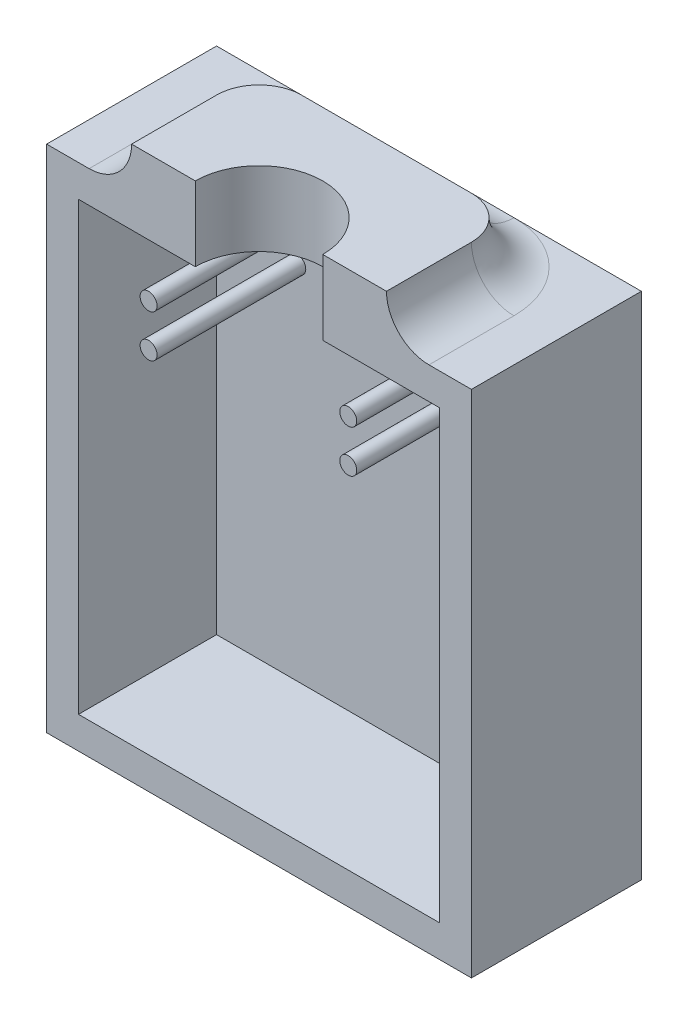
ISO-10303-21;
HEADER;
FILE_DESCRIPTION(('STEP AP214'),'2;1');
FILE_NAME('part.step','',(''),(''),'','','');
FILE_SCHEMA(('AUTOMOTIVE_DESIGN { 1 0 10303 214 1 1 1 1 }'));
ENDSEC;
DATA;
#1=APPLICATION_CONTEXT('core data for automotive mechanical design processes');
#2=APPLICATION_PROTOCOL_DEFINITION('international standard','automotive_design',2000,#1);
#3=PRODUCT_CONTEXT('',#1,'mechanical');
#4=PRODUCT('Part','Part','',(#3));
#5=PRODUCT_RELATED_PRODUCT_CATEGORY('part','',(#4));
#6=PRODUCT_DEFINITION_FORMATION('','',#4);
#7=PRODUCT_DEFINITION_CONTEXT('part definition',#1,'design');
#8=PRODUCT_DEFINITION('design','',#6,#7);
#9=PRODUCT_DEFINITION_SHAPE('','',#8);
#10=(LENGTH_UNIT() NAMED_UNIT(*) SI_UNIT(.MILLI.,.METRE.));
#11=(NAMED_UNIT(*) PLANE_ANGLE_UNIT() SI_UNIT($,.RADIAN.));
#12=(NAMED_UNIT(*) SI_UNIT($,.STERADIAN.) SOLID_ANGLE_UNIT());
#13=UNCERTAINTY_MEASURE_WITH_UNIT(LENGTH_MEASURE(1.E-05),#10,'distance_accuracy_value','');
#14=(GEOMETRIC_REPRESENTATION_CONTEXT(3) GLOBAL_UNCERTAINTY_ASSIGNED_CONTEXT((#13)) GLOBAL_UNIT_ASSIGNED_CONTEXT((#10,
#11,#12)) REPRESENTATION_CONTEXT('',''));
#15=CARTESIAN_POINT('',(0.,0.,0.));
#16=DIRECTION('',(0.,0.,1.));
#17=DIRECTION('',(1.,0.,0.));
#18=AXIS2_PLACEMENT_3D('',#15,#16,#17);
#19=CARTESIAN_POINT('',(0.,120.,0.));
#20=DIRECTION('',(0.,-1.,0.));
#21=DIRECTION('',(0.,0.,-1.));
#22=AXIS2_PLACEMENT_3D('',#19,#20,#21);
#23=PLANE('',#22);
#24=CARTESIAN_POINT('',(20.,120.,0.));
#25=DIRECTION('',(0.,-1.,0.));
#26=DIRECTION('',(0.,0.,-1.));
#27=AXIS2_PLACEMENT_3D('',#24,#25,#26);
#28=CIRCLE('',#27,20.);
#29=CARTESIAN_POINT('',(40.,120.,0.));
#30=VERTEX_POINT('',#29);
#31=CARTESIAN_POINT('',(20.,120.,-20.));
#32=VERTEX_POINT('',#31);
#33=EDGE_CURVE('E296',#30,#32,#28,.F.);
#34=ORIENTED_EDGE('',*,*,#33,.F.);
#35=DIRECTION('',(0.,0.,-1.));
#36=VECTOR('',#35,1.);
#37=CARTESIAN_POINT('',(40.,120.,20.));
#38=LINE('',#37,#36);
#39=CARTESIAN_POINT('',(40.,120.,20.));
#40=VERTEX_POINT('',#39);
#41=EDGE_CURVE('E305',#30,#40,#38,.F.);
#42=ORIENTED_EDGE('',*,*,#41,.T.);
#43=DIRECTION('',(1.,0.,0.));
#44=VECTOR('',#43,1.);
#45=CARTESIAN_POINT('',(50.,120.,20.));
#46=LINE('',#45,#44);
#47=CARTESIAN_POINT('',(50.,120.,20.));
#48=VERTEX_POINT('',#47);
#49=EDGE_CURVE('E248',#40,#48,#46,.T.);
#50=ORIENTED_EDGE('',*,*,#49,.T.);
#51=DIRECTION('',(0.,0.,-1.));
#52=VECTOR('',#51,1.);
#53=CARTESIAN_POINT('',(50.,120.,-20.));
#54=LINE('',#53,#52);
#55=CARTESIAN_POINT('',(50.,120.,-20.));
#56=VERTEX_POINT('',#55);
#57=EDGE_CURVE('E253',#48,#56,#54,.T.);
#58=ORIENTED_EDGE('',*,*,#57,.T.);
#59=DIRECTION('',(-1.,0.,0.));
#60=VECTOR('',#59,1.);
#61=CARTESIAN_POINT('',(50.,120.,-20.));
#62=LINE('',#61,#60);
#63=EDGE_CURVE('E256',#56,#32,#62,.T.);
#64=ORIENTED_EDGE('',*,*,#63,.T.);
#65=EDGE_LOOP('',(#34,#42,#50,#58,#64));
#66=FACE_BOUND('',#65,.T.);
#67=ADVANCED_FACE('F50',(#66),#23,.F.);
#68=CARTESIAN_POINT('',(50.,120.,20.));
#69=DIRECTION('',(0.,0.,-1.));
#70=DIRECTION('',(-1.,0.,0.));
#71=AXIS2_PLACEMENT_3D('',#68,#69,#70);
#72=PLANE('',#71);
#73=DIRECTION('',(1.,0.,0.));
#74=VECTOR('',#73,1.);
#75=CARTESIAN_POINT('',(0.,112.5,20.));
#76=LINE('',#75,#74);
#77=CARTESIAN_POINT('',(-42.5,112.5,20.));
#78=VERTEX_POINT('',#77);
#79=CARTESIAN_POINT('',(-15.,112.5,20.));
#80=VERTEX_POINT('',#79);
#81=EDGE_CURVE('E231',#78,#80,#76,.T.);
#82=ORIENTED_EDGE('',*,*,#81,.T.);
#83=DIRECTION('',(0.,1.,0.));
#84=VECTOR('',#83,1.);
#85=CARTESIAN_POINT('',(-15.,80.,20.));
#86=LINE('',#85,#84);
#87=CARTESIAN_POINT('',(-15.,130.,20.));
#88=VERTEX_POINT('',#87);
#89=EDGE_CURVE('E63',#80,#88,#86,.T.);
#90=ORIENTED_EDGE('',*,*,#89,.T.);
#91=DIRECTION('',(1.,0.,0.));
#92=VECTOR('',#91,1.);
#93=CARTESIAN_POINT('',(0.,130.,20.));
#94=LINE('',#93,#92);
#95=CARTESIAN_POINT('',(-30.,130.,20.));
#96=VERTEX_POINT('',#95);
#97=EDGE_CURVE('E176',#96,#88,#94,.T.);
#98=ORIENTED_EDGE('',*,*,#97,.F.);
#99=CARTESIAN_POINT('',(-40.,130.,20.));
#100=DIRECTION('',(0.,0.,-1.));
#101=DIRECTION('',(-1.,0.,0.));
#102=AXIS2_PLACEMENT_3D('',#99,#100,#101);
#103=CIRCLE('',#102,10.);
#104=CARTESIAN_POINT('',(-40.,120.,20.));
#105=VERTEX_POINT('',#104);
#106=EDGE_CURVE('E11',#96,#105,#103,.T.);
#107=ORIENTED_EDGE('',*,*,#106,.T.);
#108=CARTESIAN_POINT('',(-50.,120.,20.));
#109=VERTEX_POINT('',#108);
#110=EDGE_CURVE('E252',#109,#105,#46,.T.);
#111=ORIENTED_EDGE('',*,*,#110,.F.);
#112=DIRECTION('',(0.,-1.,0.));
#113=VECTOR('',#112,1.);
#114=CARTESIAN_POINT('',(-50.,120.,20.));
#115=LINE('',#114,#113);
#116=CARTESIAN_POINT('',(-50.,0.,20.));
#117=VERTEX_POINT('',#116);
#118=EDGE_CURVE('E290',#109,#117,#115,.T.);
#119=ORIENTED_EDGE('',*,*,#118,.T.);
#120=DIRECTION('',(1.,0.,0.));
#121=VECTOR('',#120,1.);
#122=CARTESIAN_POINT('',(50.,0.,20.));
#123=LINE('',#122,#121);
#124=CARTESIAN_POINT('',(50.,0.,20.));
#125=VERTEX_POINT('',#124);
#126=EDGE_CURVE('E269',#117,#125,#123,.T.);
#127=ORIENTED_EDGE('',*,*,#126,.T.);
#128=DIRECTION('',(0.,-1.,0.));
#129=VECTOR('',#128,1.);
#130=CARTESIAN_POINT('',(50.,120.,20.));
#131=LINE('',#130,#129);
#132=EDGE_CURVE('E284',#48,#125,#131,.T.);
#133=ORIENTED_EDGE('',*,*,#132,.F.);
#134=ORIENTED_EDGE('',*,*,#49,.F.);
#135=CARTESIAN_POINT('',(40.,130.,20.));
#136=DIRECTION('',(0.,0.,-1.));
#137=DIRECTION('',(-1.,0.,0.));
#138=AXIS2_PLACEMENT_3D('',#135,#136,#137);
#139=CIRCLE('',#138,10.);
#140=CARTESIAN_POINT('',(30.,130.,20.));
#141=VERTEX_POINT('',#140);
#142=EDGE_CURVE('E60',#40,#141,#139,.T.);
#143=ORIENTED_EDGE('',*,*,#142,.T.);
#144=CARTESIAN_POINT('',(15.,130.,20.));
#145=VERTEX_POINT('',#144);
#146=EDGE_CURVE('E172',#145,#141,#94,.T.);
#147=ORIENTED_EDGE('',*,*,#146,.F.);
#148=DIRECTION('',(0.,1.,0.));
#149=VECTOR('',#148,1.);
#150=CARTESIAN_POINT('',(15.,80.,20.));
#151=LINE('',#150,#149);
#152=CARTESIAN_POINT('',(15.,112.5,20.));
#153=VERTEX_POINT('',#152);
#154=EDGE_CURVE('E163',#145,#153,#151,.F.);
#155=ORIENTED_EDGE('',*,*,#154,.T.);
#156=CARTESIAN_POINT('',(42.5,112.5,20.));
#157=VERTEX_POINT('',#156);
#158=EDGE_CURVE('E212',#153,#157,#76,.T.);
#159=ORIENTED_EDGE('',*,*,#158,.T.);
#160=DIRECTION('',(0.,-1.,0.));
#161=VECTOR('',#160,1.);
#162=CARTESIAN_POINT('',(42.5,120.,20.));
#163=LINE('',#162,#161);
#164=CARTESIAN_POINT('',(42.5,7.5,20.));
#165=VERTEX_POINT('',#164);
#166=EDGE_CURVE('E226',#157,#165,#163,.T.);
#167=ORIENTED_EDGE('',*,*,#166,.T.);
#168=DIRECTION('',(1.,0.,0.));
#169=VECTOR('',#168,1.);
#170=CARTESIAN_POINT('',(0.,7.5,20.));
#171=LINE('',#170,#169);
#172=CARTESIAN_POINT('',(-42.5,7.5,20.));
#173=VERTEX_POINT('',#172);
#174=EDGE_CURVE('E210',#173,#165,#171,.T.);
#175=ORIENTED_EDGE('',*,*,#174,.F.);
#176=DIRECTION('',(0.,-1.,0.));
#177=VECTOR('',#176,1.);
#178=CARTESIAN_POINT('',(-42.5,120.,20.));
#179=LINE('',#178,#177);
#180=EDGE_CURVE('E234',#78,#173,#179,.T.);
#181=ORIENTED_EDGE('',*,*,#180,.F.);
#182=EDGE_LOOP('',(#82,#90,#98,#107,#111,#119,#127,#133,#134,#143,#147,#155,#159,#167,#175,#181));
#183=FACE_BOUND('',#182,.T.);
#184=ADVANCED_FACE('F181',(#183),#72,.F.);
#185=CARTESIAN_POINT('',(-50.,120.,-20.));
#186=DIRECTION('',(1.,0.,0.));
#187=DIRECTION('',(0.,0.,-1.));
#188=AXIS2_PLACEMENT_3D('',#185,#186,#187);
#189=PLANE('',#188);
#190=DIRECTION('',(0.,0.,1.));
#191=VECTOR('',#190,1.);
#192=CARTESIAN_POINT('',(-50.,0.,-20.));
#193=LINE('',#192,#191);
#194=CARTESIAN_POINT('',(-50.,0.,-20.));
#195=VERTEX_POINT('',#194);
#196=EDGE_CURVE('E240',#195,#117,#193,.T.);
#197=ORIENTED_EDGE('',*,*,#196,.T.);
#198=ORIENTED_EDGE('',*,*,#118,.F.);
#199=DIRECTION('',(0.,0.,1.));
#200=VECTOR('',#199,1.);
#201=CARTESIAN_POINT('',(-50.,120.,-20.));
#202=LINE('',#201,#200);
#203=CARTESIAN_POINT('',(-50.,120.,-20.));
#204=VERTEX_POINT('',#203);
#205=EDGE_CURVE('E244',#204,#109,#202,.T.);
#206=ORIENTED_EDGE('',*,*,#205,.F.);
#207=DIRECTION('',(0.,-1.,0.));
#208=VECTOR('',#207,1.);
#209=CARTESIAN_POINT('',(-50.,120.,-20.));
#210=LINE('',#209,#208);
#211=EDGE_CURVE('E264',#204,#195,#210,.T.);
#212=ORIENTED_EDGE('',*,*,#211,.T.);
#213=EDGE_LOOP('',(#197,#198,#206,#212));
#214=FACE_BOUND('',#213,.T.);
#215=ADVANCED_FACE('F336',(#214),#189,.F.);
#216=CARTESIAN_POINT('',(50.,120.,-20.));
#217=DIRECTION('',(-1.,0.,0.));
#218=DIRECTION('',(0.,0.,1.));
#219=AXIS2_PLACEMENT_3D('',#216,#217,#218);
#220=PLANE('',#219);
#221=DIRECTION('',(0.,0.,-1.));
#222=VECTOR('',#221,1.);
#223=CARTESIAN_POINT('',(50.,0.,-20.));
#224=LINE('',#223,#222);
#225=CARTESIAN_POINT('',(50.,0.,-20.));
#226=VERTEX_POINT('',#225);
#227=EDGE_CURVE('E272',#125,#226,#224,.T.);
#228=ORIENTED_EDGE('',*,*,#227,.T.);
#229=DIRECTION('',(0.,-1.,0.));
#230=VECTOR('',#229,1.);
#231=CARTESIAN_POINT('',(50.,120.,-20.));
#232=LINE('',#231,#230);
#233=EDGE_CURVE('E276',#56,#226,#232,.T.);
#234=ORIENTED_EDGE('',*,*,#233,.F.);
#235=ORIENTED_EDGE('',*,*,#57,.F.);
#236=ORIENTED_EDGE('',*,*,#132,.T.);
#237=EDGE_LOOP('',(#228,#234,#235,#236));
#238=FACE_BOUND('',#237,.T.);
#239=ADVANCED_FACE('F343',(#238),#220,.F.);
#240=CARTESIAN_POINT('',(50.,120.,-20.));
#241=DIRECTION('',(0.,0.,1.));
#242=DIRECTION('',(1.,0.,0.));
#243=AXIS2_PLACEMENT_3D('',#240,#241,#242);
#244=PLANE('',#243);
#245=DIRECTION('',(-1.,0.,0.));
#246=VECTOR('',#245,1.);
#247=CARTESIAN_POINT('',(50.,0.,-20.));
#248=LINE('',#247,#246);
#249=EDGE_CURVE('E249',#226,#195,#248,.T.);
#250=ORIENTED_EDGE('',*,*,#249,.T.);
#251=ORIENTED_EDGE('',*,*,#211,.F.);
#252=CARTESIAN_POINT('',(-20.,120.,-20.));
#253=VERTEX_POINT('',#252);
#254=EDGE_CURVE('E259',#253,#204,#62,.T.);
#255=ORIENTED_EDGE('',*,*,#254,.F.);
#256=EDGE_CURVE('E263',#32,#253,#62,.T.);
#257=ORIENTED_EDGE('',*,*,#256,.F.);
#258=ORIENTED_EDGE('',*,*,#63,.F.);
#259=ORIENTED_EDGE('',*,*,#233,.T.);
#260=EDGE_LOOP('',(#250,#251,#255,#257,#258,#259));
#261=FACE_BOUND('',#260,.T.);
#262=ADVANCED_FACE('F350',(#261),#244,.F.);
#263=ORIENTED_EDGE('',*,*,#110,.T.);
#264=DIRECTION('',(0.,0.,-1.));
#265=VECTOR('',#264,1.);
#266=CARTESIAN_POINT('',(-40.,120.,0.));
#267=LINE('',#266,#265);
#268=CARTESIAN_POINT('',(-40.,120.,0.));
#269=VERTEX_POINT('',#268);
#270=EDGE_CURVE('E294',#105,#269,#267,.T.);
#271=ORIENTED_EDGE('',*,*,#270,.T.);
#272=CARTESIAN_POINT('',(-20.,120.,0.));
#273=DIRECTION('',(0.,-1.,0.));
#274=DIRECTION('',(0.,0.,-1.));
#275=AXIS2_PLACEMENT_3D('',#272,#273,#274);
#276=CIRCLE('',#275,20.);
#277=EDGE_CURVE('E293',#253,#269,#276,.F.);
#278=ORIENTED_EDGE('',*,*,#277,.F.);
#279=ORIENTED_EDGE('',*,*,#254,.T.);
#280=ORIENTED_EDGE('',*,*,#205,.T.);
#281=EDGE_LOOP('',(#263,#271,#278,#279,#280));
#282=FACE_BOUND('',#281,.T.);
#283=ADVANCED_FACE('F335',(#282),#23,.F.);
#284=CARTESIAN_POINT('',(0.,0.,0.));
#285=DIRECTION('',(0.,-1.,0.));
#286=DIRECTION('',(0.,0.,-1.));
#287=AXIS2_PLACEMENT_3D('',#284,#285,#286);
#288=PLANE('',#287);
#289=ORIENTED_EDGE('',*,*,#196,.F.);
#290=ORIENTED_EDGE('',*,*,#249,.F.);
#291=ORIENTED_EDGE('',*,*,#227,.F.);
#292=ORIENTED_EDGE('',*,*,#126,.F.);
#293=EDGE_LOOP('',(#289,#290,#291,#292));
#294=FACE_BOUND('',#293,.T.);
#295=ADVANCED_FACE('F349',(#294),#288,.T.);
#296=CARTESIAN_POINT('',(-42.5,120.,-20.));
#297=DIRECTION('',(1.,0.,0.));
#298=DIRECTION('',(0.,0.,-1.));
#299=AXIS2_PLACEMENT_3D('',#296,#297,#298);
#300=PLANE('',#299);
#301=DIRECTION('',(0.,0.,1.));
#302=VECTOR('',#301,1.);
#303=CARTESIAN_POINT('',(-42.5,7.5,0.));
#304=LINE('',#303,#302);
#305=CARTESIAN_POINT('',(-42.5,7.5,-12.5));
#306=VERTEX_POINT('',#305);
#307=EDGE_CURVE('E204',#306,#173,#304,.T.);
#308=ORIENTED_EDGE('',*,*,#307,.F.);
#309=DIRECTION('',(0.,-1.,0.));
#310=VECTOR('',#309,1.);
#311=CARTESIAN_POINT('',(-42.5,120.,-12.5));
#312=LINE('',#311,#310);
#313=CARTESIAN_POINT('',(-42.5,112.5,-12.5));
#314=VERTEX_POINT('',#313);
#315=EDGE_CURVE('E214',#314,#306,#312,.T.);
#316=ORIENTED_EDGE('',*,*,#315,.F.);
#317=DIRECTION('',(0.,0.,1.));
#318=VECTOR('',#317,1.);
#319=CARTESIAN_POINT('',(-42.5,112.5,0.));
#320=LINE('',#319,#318);
#321=EDGE_CURVE('E206',#314,#78,#320,.T.);
#322=ORIENTED_EDGE('',*,*,#321,.T.);
#323=ORIENTED_EDGE('',*,*,#180,.T.);
#324=EDGE_LOOP('',(#308,#316,#322,#323));
#325=FACE_BOUND('',#324,.T.);
#326=ADVANCED_FACE('F379',(#325),#300,.T.);
#327=CARTESIAN_POINT('',(42.5,120.,-20.));
#328=DIRECTION('',(-1.,0.,0.));
#329=DIRECTION('',(0.,0.,1.));
#330=AXIS2_PLACEMENT_3D('',#327,#328,#329);
#331=PLANE('',#330);
#332=DIRECTION('',(0.,0.,-1.));
#333=VECTOR('',#332,1.);
#334=CARTESIAN_POINT('',(42.5,7.5,0.));
#335=LINE('',#334,#333);
#336=CARTESIAN_POINT('',(42.5,7.5,-12.5));
#337=VERTEX_POINT('',#336);
#338=EDGE_CURVE('E222',#165,#337,#335,.T.);
#339=ORIENTED_EDGE('',*,*,#338,.F.);
#340=ORIENTED_EDGE('',*,*,#166,.F.);
#341=DIRECTION('',(0.,0.,-1.));
#342=VECTOR('',#341,1.);
#343=CARTESIAN_POINT('',(42.5,112.5,0.));
#344=LINE('',#343,#342);
#345=CARTESIAN_POINT('',(42.5,112.5,-12.5));
#346=VERTEX_POINT('',#345);
#347=EDGE_CURVE('E221',#157,#346,#344,.T.);
#348=ORIENTED_EDGE('',*,*,#347,.T.);
#349=DIRECTION('',(0.,-1.,0.));
#350=VECTOR('',#349,1.);
#351=CARTESIAN_POINT('',(42.5,120.,-12.5));
#352=LINE('',#351,#350);
#353=EDGE_CURVE('E217',#346,#337,#352,.T.);
#354=ORIENTED_EDGE('',*,*,#353,.T.);
#355=EDGE_LOOP('',(#339,#340,#348,#354));
#356=FACE_BOUND('',#355,.T.);
#357=ADVANCED_FACE('F368',(#356),#331,.T.);
#358=CARTESIAN_POINT('',(50.,120.,-12.5));
#359=DIRECTION('',(0.,0.,1.));
#360=DIRECTION('',(1.,0.,0.));
#361=AXIS2_PLACEMENT_3D('',#358,#359,#360);
#362=PLANE('',#361);
#363=CARTESIAN_POINT('',(23.5,102.5,-12.5));
#364=DIRECTION('',(0.,0.,1.));
#365=DIRECTION('',(-1.,0.,0.));
#366=AXIS2_PLACEMENT_3D('',#363,#364,#365);
#367=CIRCLE('',#366,2.);
#368=CARTESIAN_POINT('',(21.5,102.5,-12.5));
#369=VERTEX_POINT('',#368);
#370=EDGE_CURVE('E396',#369,#369,#367,.T.);
#371=ORIENTED_EDGE('',*,*,#370,.F.);
#372=EDGE_LOOP('',(#371));
#373=FACE_BOUND('',#372,.T.);
#374=CARTESIAN_POINT('',(23.5,92.5,-12.5));
#375=DIRECTION('',(0.,0.,1.));
#376=DIRECTION('',(-1.,0.,0.));
#377=AXIS2_PLACEMENT_3D('',#374,#375,#376);
#378=CIRCLE('',#377,2.);
#379=CARTESIAN_POINT('',(21.5,92.5,-12.5));
#380=VERTEX_POINT('',#379);
#381=EDGE_CURVE('E410',#380,#380,#378,.T.);
#382=ORIENTED_EDGE('',*,*,#381,.F.);
#383=EDGE_LOOP('',(#382));
#384=FACE_BOUND('',#383,.T.);
#385=CARTESIAN_POINT('',(-23.5,92.5,-12.5));
#386=DIRECTION('',(0.,0.,1.));
#387=DIRECTION('',(1.,0.,0.));
#388=AXIS2_PLACEMENT_3D('',#385,#386,#387);
#389=CIRCLE('',#388,2.);
#390=CARTESIAN_POINT('',(-21.5,92.5,-12.5));
#391=VERTEX_POINT('',#390);
#392=EDGE_CURVE('E391',#391,#391,#389,.T.);
#393=ORIENTED_EDGE('',*,*,#392,.F.);
#394=EDGE_LOOP('',(#393));
#395=FACE_BOUND('',#394,.T.);
#396=CARTESIAN_POINT('',(-23.5,102.5,-12.5));
#397=DIRECTION('',(0.,0.,1.));
#398=DIRECTION('',(1.,0.,0.));
#399=AXIS2_PLACEMENT_3D('',#396,#397,#398);
#400=CIRCLE('',#399,2.);
#401=CARTESIAN_POINT('',(-21.5,102.5,-12.5));
#402=VERTEX_POINT('',#401);
#403=EDGE_CURVE('E390',#402,#402,#400,.T.);
#404=ORIENTED_EDGE('',*,*,#403,.F.);
#405=EDGE_LOOP('',(#404));
#406=FACE_BOUND('',#405,.T.);
#407=DIRECTION('',(-1.,0.,0.));
#408=VECTOR('',#407,1.);
#409=CARTESIAN_POINT('',(0.,7.5,-12.5));
#410=LINE('',#409,#408);
#411=EDGE_CURVE('E215',#337,#306,#410,.T.);
#412=ORIENTED_EDGE('',*,*,#411,.F.);
#413=ORIENTED_EDGE('',*,*,#353,.F.);
#414=DIRECTION('',(-1.,0.,0.));
#415=VECTOR('',#414,1.);
#416=CARTESIAN_POINT('',(0.,112.5,-12.5));
#417=LINE('',#416,#415);
#418=EDGE_CURVE('E219',#346,#314,#417,.T.);
#419=ORIENTED_EDGE('',*,*,#418,.T.);
#420=ORIENTED_EDGE('',*,*,#315,.T.);
#421=EDGE_LOOP('',(#412,#413,#419,#420));
#422=FACE_BOUND('',#421,.T.);
#423=ADVANCED_FACE('F380',(#373,#384,#395,#406,#422),#362,.T.);
#424=CARTESIAN_POINT('',(0.,112.5,0.));
#425=DIRECTION('',(0.,-1.,0.));
#426=DIRECTION('',(0.,0.,-1.));
#427=AXIS2_PLACEMENT_3D('',#424,#425,#426);
#428=PLANE('',#427);
#429=CARTESIAN_POINT('',(0.,112.5,20.));
#430=DIRECTION('',(0.,-1.,0.));
#431=DIRECTION('',(0.,0.,-1.));
#432=AXIS2_PLACEMENT_3D('',#429,#430,#431);
#433=CIRCLE('',#432,15.);
#434=EDGE_CURVE('E164',#80,#153,#433,.T.);
#435=ORIENTED_EDGE('',*,*,#434,.F.);
#436=ORIENTED_EDGE('',*,*,#81,.F.);
#437=ORIENTED_EDGE('',*,*,#321,.F.);
#438=ORIENTED_EDGE('',*,*,#418,.F.);
#439=ORIENTED_EDGE('',*,*,#347,.F.);
#440=ORIENTED_EDGE('',*,*,#158,.F.);
#441=EDGE_LOOP('',(#435,#436,#437,#438,#439,#440));
#442=FACE_BOUND('',#441,.T.);
#443=ADVANCED_FACE('F371',(#442),#428,.T.);
#444=CARTESIAN_POINT('',(0.,7.5,0.));
#445=DIRECTION('',(0.,-1.,0.));
#446=DIRECTION('',(0.,0.,-1.));
#447=AXIS2_PLACEMENT_3D('',#444,#445,#446);
#448=PLANE('',#447);
#449=ORIENTED_EDGE('',*,*,#307,.T.);
#450=ORIENTED_EDGE('',*,*,#174,.T.);
#451=ORIENTED_EDGE('',*,*,#338,.T.);
#452=ORIENTED_EDGE('',*,*,#411,.T.);
#453=EDGE_LOOP('',(#449,#450,#451,#452));
#454=FACE_BOUND('',#453,.T.);
#455=ADVANCED_FACE('F384',(#454),#448,.F.);
#456=CARTESIAN_POINT('',(0.,130.,0.));
#457=DIRECTION('',(0.,1.,0.));
#458=DIRECTION('',(0.,0.,1.));
#459=AXIS2_PLACEMENT_3D('',#456,#457,#458);
#460=PLANE('',#459);
#461=CARTESIAN_POINT('',(0.,130.,20.));
#462=DIRECTION('',(0.,1.,0.));
#463=DIRECTION('',(0.,0.,1.));
#464=AXIS2_PLACEMENT_3D('',#461,#462,#463);
#465=CIRCLE('',#464,15.);
#466=EDGE_CURVE('E165',#145,#88,#465,.T.);
#467=ORIENTED_EDGE('',*,*,#466,.F.);
#468=ORIENTED_EDGE('',*,*,#146,.T.);
#469=DIRECTION('',(0.,0.,-1.));
#470=VECTOR('',#469,1.);
#471=CARTESIAN_POINT('',(30.,130.,0.));
#472=LINE('',#471,#470);
#473=CARTESIAN_POINT('',(30.,130.,0.));
#474=VERTEX_POINT('',#473);
#475=EDGE_CURVE('E186',#141,#474,#472,.T.);
#476=ORIENTED_EDGE('',*,*,#475,.T.);
#477=CARTESIAN_POINT('',(20.,130.,0.));
#478=DIRECTION('',(0.,1.,0.));
#479=DIRECTION('',(0.,0.,1.));
#480=AXIS2_PLACEMENT_3D('',#477,#478,#479);
#481=CIRCLE('',#480,10.);
#482=CARTESIAN_POINT('',(20.,130.,-9.99999999999999));
#483=VERTEX_POINT('',#482);
#484=EDGE_CURVE('E310',#474,#483,#481,.T.);
#485=ORIENTED_EDGE('',*,*,#484,.T.);
#486=DIRECTION('',(1.,0.,0.));
#487=VECTOR('',#486,1.);
#488=CARTESIAN_POINT('',(0.,130.,-9.99999999999999));
#489=LINE('',#488,#487);
#490=CARTESIAN_POINT('',(-20.,130.,-9.99999999999999));
#491=VERTEX_POINT('',#490);
#492=EDGE_CURVE('E196',#491,#483,#489,.T.);
#493=ORIENTED_EDGE('',*,*,#492,.F.);
#494=CARTESIAN_POINT('',(-20.,130.,0.));
#495=DIRECTION('',(0.,1.,0.));
#496=DIRECTION('',(0.,0.,1.));
#497=AXIS2_PLACEMENT_3D('',#494,#495,#496);
#498=CIRCLE('',#497,10.);
#499=CARTESIAN_POINT('',(-30.,130.,0.));
#500=VERTEX_POINT('',#499);
#501=EDGE_CURVE('E74',#491,#500,#498,.T.);
#502=ORIENTED_EDGE('',*,*,#501,.T.);
#503=DIRECTION('',(0.,0.,-1.));
#504=VECTOR('',#503,1.);
#505=CARTESIAN_POINT('',(-30.,130.,0.));
#506=LINE('',#505,#504);
#507=EDGE_CURVE('E200',#96,#500,#506,.T.);
#508=ORIENTED_EDGE('',*,*,#507,.F.);
#509=ORIENTED_EDGE('',*,*,#97,.T.);
#510=EDGE_LOOP('',(#467,#468,#476,#485,#493,#502,#508,#509));
#511=FACE_BOUND('',#510,.T.);
#512=ADVANCED_FACE('F175',(#511),#460,.T.);
#513=CARTESIAN_POINT('',(-40.,130.,0.));
#514=DIRECTION('',(0.,0.,-1.));
#515=DIRECTION('',(-1.,0.,0.));
#516=AXIS2_PLACEMENT_3D('',#513,#514,#515);
#517=CYLINDRICAL_SURFACE('',#516,10.);
#518=ORIENTED_EDGE('',*,*,#106,.F.);
#519=ORIENTED_EDGE('',*,*,#507,.T.);
#520=CARTESIAN_POINT('',(-40.,130.,0.));
#521=DIRECTION('',(0.,0.,1.));
#522=DIRECTION('',(1.,0.,0.));
#523=AXIS2_PLACEMENT_3D('',#520,#521,#522);
#524=CIRCLE('',#523,10.);
#525=EDGE_CURVE('E51',#269,#500,#524,.T.);
#526=ORIENTED_EDGE('',*,*,#525,.F.);
#527=ORIENTED_EDGE('',*,*,#270,.F.);
#528=EDGE_LOOP('',(#518,#519,#526,#527));
#529=FACE_BOUND('',#528,.T.);
#530=ADVANCED_FACE('F47',(#529),#517,.F.);
#531=CARTESIAN_POINT('',(-20.,130.,0.));
#532=DIRECTION('',(0.,-1.,0.));
#533=DIRECTION('',(0.,0.,-1.));
#534=AXIS2_PLACEMENT_3D('',#531,#532,#533);
#535=TOROIDAL_SURFACE('',#534,20.,10.);
#536=ORIENTED_EDGE('',*,*,#525,.T.);
#537=ORIENTED_EDGE('',*,*,#501,.F.);
#538=CARTESIAN_POINT('',(-20.,130.,-20.));
#539=DIRECTION('',(1.,0.,0.));
#540=DIRECTION('',(0.,0.,-1.));
#541=AXIS2_PLACEMENT_3D('',#538,#539,#540);
#542=CIRCLE('',#541,10.);
#543=EDGE_CURVE('E192',#253,#491,#542,.F.);
#544=ORIENTED_EDGE('',*,*,#543,.F.);
#545=ORIENTED_EDGE('',*,*,#277,.T.);
#546=EDGE_LOOP('',(#536,#537,#544,#545));
#547=FACE_BOUND('',#546,.T.);
#548=ADVANCED_FACE('F326',(#547),#535,.F.);
#549=CARTESIAN_POINT('',(0.,130.,-20.));
#550=DIRECTION('',(1.,0.,0.));
#551=DIRECTION('',(0.,0.,-1.));
#552=AXIS2_PLACEMENT_3D('',#549,#550,#551);
#553=CYLINDRICAL_SURFACE('',#552,10.);
#554=ORIENTED_EDGE('',*,*,#543,.T.);
#555=ORIENTED_EDGE('',*,*,#492,.T.);
#556=CARTESIAN_POINT('',(20.,130.,-20.));
#557=DIRECTION('',(-1.,0.,0.));
#558=DIRECTION('',(0.,0.,1.));
#559=AXIS2_PLACEMENT_3D('',#556,#557,#558);
#560=CIRCLE('',#559,10.);
#561=EDGE_CURVE('E314',#32,#483,#560,.T.);
#562=ORIENTED_EDGE('',*,*,#561,.F.);
#563=ORIENTED_EDGE('',*,*,#256,.T.);
#564=EDGE_LOOP('',(#554,#555,#562,#563));
#565=FACE_BOUND('',#564,.T.);
#566=ADVANCED_FACE('F324',(#565),#553,.F.);
#567=CARTESIAN_POINT('',(20.,130.,0.));
#568=DIRECTION('',(0.,-1.,0.));
#569=DIRECTION('',(0.,0.,-1.));
#570=AXIS2_PLACEMENT_3D('',#567,#568,#569);
#571=TOROIDAL_SURFACE('',#570,20.,10.);
#572=ORIENTED_EDGE('',*,*,#561,.T.);
#573=ORIENTED_EDGE('',*,*,#484,.F.);
#574=CARTESIAN_POINT('',(40.,130.,0.));
#575=DIRECTION('',(0.,0.,1.));
#576=DIRECTION('',(1.,0.,0.));
#577=AXIS2_PLACEMENT_3D('',#574,#575,#576);
#578=CIRCLE('',#577,10.);
#579=EDGE_CURVE('E315',#30,#474,#578,.F.);
#580=ORIENTED_EDGE('',*,*,#579,.F.);
#581=ORIENTED_EDGE('',*,*,#33,.T.);
#582=EDGE_LOOP('',(#572,#573,#580,#581));
#583=FACE_BOUND('',#582,.T.);
#584=ADVANCED_FACE('F357',(#583),#571,.F.);
#585=CARTESIAN_POINT('',(40.,130.,0.));
#586=DIRECTION('',(0.,0.,1.));
#587=DIRECTION('',(1.,0.,0.));
#588=AXIS2_PLACEMENT_3D('',#585,#586,#587);
#589=CYLINDRICAL_SURFACE('',#588,10.);
#590=ORIENTED_EDGE('',*,*,#142,.F.);
#591=ORIENTED_EDGE('',*,*,#41,.F.);
#592=ORIENTED_EDGE('',*,*,#579,.T.);
#593=ORIENTED_EDGE('',*,*,#475,.F.);
#594=EDGE_LOOP('',(#590,#591,#592,#593));
#595=FACE_BOUND('',#594,.T.);
#596=ADVANCED_FACE('F360',(#595),#589,.F.);
#597=CARTESIAN_POINT('',(0.,80.,20.));
#598=DIRECTION('',(0.,1.,0.));
#599=DIRECTION('',(0.,0.,1.));
#600=AXIS2_PLACEMENT_3D('',#597,#598,#599);
#601=CYLINDRICAL_SURFACE('',#600,15.);
#602=ORIENTED_EDGE('',*,*,#434,.T.);
#603=ORIENTED_EDGE('',*,*,#154,.F.);
#604=ORIENTED_EDGE('',*,*,#466,.T.);
#605=ORIENTED_EDGE('',*,*,#89,.F.);
#606=EDGE_LOOP('',(#602,#603,#604,#605));
#607=FACE_BOUND('',#606,.T.);
#608=ADVANCED_FACE('F161',(#607),#601,.F.);
#609=CARTESIAN_POINT('',(-23.5,102.5,22.5));
#610=DIRECTION('',(0.,0.,-1.));
#611=DIRECTION('',(-1.,0.,0.));
#612=AXIS2_PLACEMENT_3D('',#609,#610,#611);
#613=CYLINDRICAL_SURFACE('',#612,2.);
#614=CARTESIAN_POINT('',(-23.5,102.5,22.5));
#615=DIRECTION('',(0.,0.,1.));
#616=DIRECTION('',(1.,0.,0.));
#617=AXIS2_PLACEMENT_3D('',#614,#615,#616);
#618=CIRCLE('',#617,2.);
#619=CARTESIAN_POINT('',(-21.5,102.5,22.5));
#620=VERTEX_POINT('',#619);
#621=EDGE_CURVE('E178',#620,#620,#618,.T.);
#622=ORIENTED_EDGE('',*,*,#621,.F.);
#623=EDGE_LOOP('',(#622));
#624=FACE_BOUND('',#623,.T.);
#625=ORIENTED_EDGE('',*,*,#403,.T.);
#626=EDGE_LOOP('',(#625));
#627=FACE_BOUND('',#626,.T.);
#628=ADVANCED_FACE('F430',(#624,#627),#613,.T.);
#629=CARTESIAN_POINT('',(-23.5,102.5,22.5));
#630=DIRECTION('',(0.,0.,1.));
#631=DIRECTION('',(1.,0.,0.));
#632=AXIS2_PLACEMENT_3D('',#629,#630,#631);
#633=PLANE('',#632);
#634=ORIENTED_EDGE('',*,*,#621,.T.);
#635=EDGE_LOOP('',(#634));
#636=FACE_BOUND('',#635,.T.);
#637=ADVANCED_FACE('F429',(#636),#633,.T.);
#638=CARTESIAN_POINT('',(-23.5,92.5,22.5));
#639=DIRECTION('',(0.,0.,-1.));
#640=DIRECTION('',(-1.,0.,0.));
#641=AXIS2_PLACEMENT_3D('',#638,#639,#640);
#642=CYLINDRICAL_SURFACE('',#641,2.);
#643=CARTESIAN_POINT('',(-23.5,92.5,22.5));
#644=DIRECTION('',(0.,0.,1.));
#645=DIRECTION('',(1.,0.,0.));
#646=AXIS2_PLACEMENT_3D('',#643,#644,#645);
#647=CIRCLE('',#646,2.);
#648=CARTESIAN_POINT('',(-21.5,92.5,22.5));
#649=VERTEX_POINT('',#648);
#650=EDGE_CURVE('E411',#649,#649,#647,.T.);
#651=ORIENTED_EDGE('',*,*,#650,.F.);
#652=EDGE_LOOP('',(#651));
#653=FACE_BOUND('',#652,.T.);
#654=ORIENTED_EDGE('',*,*,#392,.T.);
#655=EDGE_LOOP('',(#654));
#656=FACE_BOUND('',#655,.T.);
#657=ADVANCED_FACE('F416',(#653,#656),#642,.T.);
#658=CARTESIAN_POINT('',(-23.5,92.5,22.5));
#659=DIRECTION('',(0.,0.,1.));
#660=DIRECTION('',(1.,0.,0.));
#661=AXIS2_PLACEMENT_3D('',#658,#659,#660);
#662=PLANE('',#661);
#663=ORIENTED_EDGE('',*,*,#650,.T.);
#664=EDGE_LOOP('',(#663));
#665=FACE_BOUND('',#664,.T.);
#666=ADVANCED_FACE('F603',(#665),#662,.T.);
#667=CARTESIAN_POINT('',(23.5,92.5,22.5));
#668=DIRECTION('',(0.,0.,-1.));
#669=DIRECTION('',(-1.,0.,0.));
#670=AXIS2_PLACEMENT_3D('',#667,#668,#669);
#671=CYLINDRICAL_SURFACE('',#670,2.);
#672=CARTESIAN_POINT('',(23.5,92.5,22.5));
#673=DIRECTION('',(0.,0.,1.));
#674=DIRECTION('',(-1.,0.,0.));
#675=AXIS2_PLACEMENT_3D('',#672,#673,#674);
#676=CIRCLE('',#675,2.);
#677=CARTESIAN_POINT('',(21.5,92.5,22.5));
#678=VERTEX_POINT('',#677);
#679=EDGE_CURVE('E401',#678,#678,#676,.T.);
#680=ORIENTED_EDGE('',*,*,#679,.F.);
#681=EDGE_LOOP('',(#680));
#682=FACE_BOUND('',#681,.T.);
#683=ORIENTED_EDGE('',*,*,#381,.T.);
#684=EDGE_LOOP('',(#683));
#685=FACE_BOUND('',#684,.T.);
#686=ADVANCED_FACE('F613',(#682,#685),#671,.T.);
#687=CARTESIAN_POINT('',(23.5,92.5,22.5));
#688=DIRECTION('',(0.,0.,-1.));
#689=DIRECTION('',(-1.,0.,0.));
#690=AXIS2_PLACEMENT_3D('',#687,#688,#689);
#691=PLANE('',#690);
#692=ORIENTED_EDGE('',*,*,#679,.T.);
#693=EDGE_LOOP('',(#692));
#694=FACE_BOUND('',#693,.T.);
#695=ADVANCED_FACE('F622',(#694),#691,.F.);
#696=CARTESIAN_POINT('',(23.5,102.5,22.5));
#697=DIRECTION('',(0.,0.,-1.));
#698=DIRECTION('',(-1.,0.,0.));
#699=AXIS2_PLACEMENT_3D('',#696,#697,#698);
#700=CYLINDRICAL_SURFACE('',#699,2.);
#701=CARTESIAN_POINT('',(23.5,102.5,22.5));
#702=DIRECTION('',(0.,0.,1.));
#703=DIRECTION('',(-1.,0.,0.));
#704=AXIS2_PLACEMENT_3D('',#701,#702,#703);
#705=CIRCLE('',#704,2.);
#706=CARTESIAN_POINT('',(21.5,102.5,22.5));
#707=VERTEX_POINT('',#706);
#708=EDGE_CURVE('E395',#707,#707,#705,.T.);
#709=ORIENTED_EDGE('',*,*,#708,.F.);
#710=EDGE_LOOP('',(#709));
#711=FACE_BOUND('',#710,.T.);
#712=ORIENTED_EDGE('',*,*,#370,.T.);
#713=EDGE_LOOP('',(#712));
#714=FACE_BOUND('',#713,.T.);
#715=ADVANCED_FACE('F634',(#711,#714),#700,.T.);
#716=CARTESIAN_POINT('',(23.5,102.5,22.5));
#717=DIRECTION('',(0.,0.,-1.));
#718=DIRECTION('',(-1.,0.,0.));
#719=AXIS2_PLACEMENT_3D('',#716,#717,#718);
#720=PLANE('',#719);
#721=ORIENTED_EDGE('',*,*,#708,.T.);
#722=EDGE_LOOP('',(#721));
#723=FACE_BOUND('',#722,.T.);
#724=ADVANCED_FACE('F643',(#723),#720,.F.);
#725=CLOSED_SHELL('',(#67,#184,#215,#239,#262,#283,#295,#326,#357,#423,#443,#455,#512,#530,#548,
#566,#584,#596,#608,#628,#637,#657,#666,#686,#695,#715,#724));
#726=MANIFOLD_SOLID_BREP('B2',#725);
#727=ADVANCED_BREP_SHAPE_REPRESENTATION('',(#18,#726),#14);
#728=SHAPE_DEFINITION_REPRESENTATION(#9,#727);
ENDSEC;
END-ISO-10303-21;
